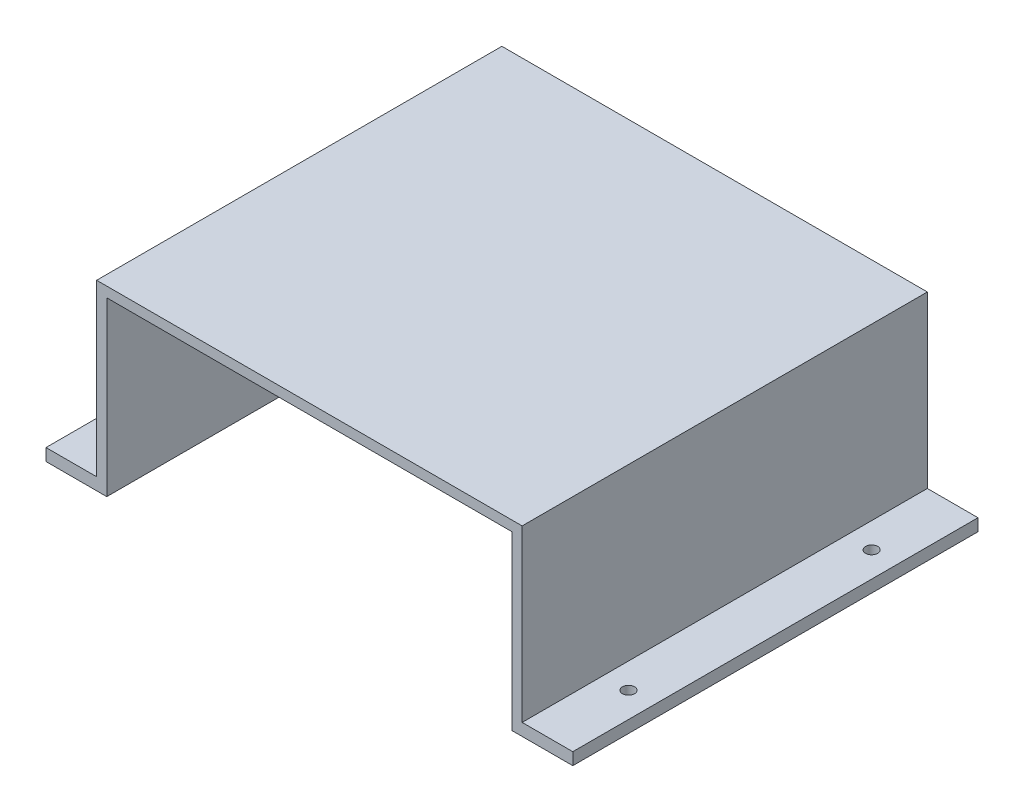
ISO-10303-21;
HEADER;
FILE_DESCRIPTION(('STEP AP214'),'2;1');
FILE_NAME('part.step','',(''),(''),'','','');
FILE_SCHEMA(('AUTOMOTIVE_DESIGN { 1 0 10303 214 1 1 1 1 }'));
ENDSEC;
DATA;
#1=APPLICATION_CONTEXT('core data for automotive mechanical design processes');
#2=APPLICATION_PROTOCOL_DEFINITION('international standard','automotive_design',2000,#1);
#3=PRODUCT_CONTEXT('',#1,'mechanical');
#4=PRODUCT('Part','Part','',(#3));
#5=PRODUCT_RELATED_PRODUCT_CATEGORY('part','',(#4));
#6=PRODUCT_DEFINITION_FORMATION('','',#4);
#7=PRODUCT_DEFINITION_CONTEXT('part definition',#1,'design');
#8=PRODUCT_DEFINITION('design','',#6,#7);
#9=PRODUCT_DEFINITION_SHAPE('','',#8);
#10=(LENGTH_UNIT() NAMED_UNIT(*) SI_UNIT(.MILLI.,.METRE.));
#11=(NAMED_UNIT(*) PLANE_ANGLE_UNIT() SI_UNIT($,.RADIAN.));
#12=(NAMED_UNIT(*) SI_UNIT($,.STERADIAN.) SOLID_ANGLE_UNIT());
#13=UNCERTAINTY_MEASURE_WITH_UNIT(LENGTH_MEASURE(1.E-05),#10,'distance_accuracy_value','');
#14=(GEOMETRIC_REPRESENTATION_CONTEXT(3) GLOBAL_UNCERTAINTY_ASSIGNED_CONTEXT((#13)) GLOBAL_UNIT_ASSIGNED_CONTEXT((#10,
#11,#12)) REPRESENTATION_CONTEXT('',''));
#15=CARTESIAN_POINT('',(0.,0.,0.));
#16=DIRECTION('',(0.,0.,1.));
#17=DIRECTION('',(1.,0.,0.));
#18=AXIS2_PLACEMENT_3D('',#15,#16,#17);
#19=CARTESIAN_POINT('',(34.5735404683645,-1.54051730772277,100.));
#20=DIRECTION('',(-1.,0.,0.));
#21=DIRECTION('',(0.,-1.,0.));
#22=AXIS2_PLACEMENT_3D('',#19,#20,#21);
#23=PLANE('',#22);
#24=DIRECTION('',(0.,0.,1.));
#25=VECTOR('',#24,1.);
#26=CARTESIAN_POINT('',(34.5735404683645,-43.5405173077228,0.));
#27=LINE('',#26,#25);
#28=CARTESIAN_POINT('',(34.5735404683645,-43.5405173077228,0.));
#29=VERTEX_POINT('',#28);
#30=CARTESIAN_POINT('',(34.5735404683645,-43.5405173077228,100.));
#31=VERTEX_POINT('',#30);
#32=EDGE_CURVE('E58',#29,#31,#27,.T.);
#33=ORIENTED_EDGE('',*,*,#32,.F.);
#34=DIRECTION('',(0.,1.,0.));
#35=VECTOR('',#34,1.);
#36=CARTESIAN_POINT('',(34.5735404683645,-1.54051730772277,0.));
#37=LINE('',#36,#35);
#38=CARTESIAN_POINT('',(34.5735404683645,-1.54051730772277,0.));
#39=VERTEX_POINT('',#38);
#40=EDGE_CURVE('E309',#29,#39,#37,.T.);
#41=ORIENTED_EDGE('',*,*,#40,.T.);
#42=DIRECTION('',(0.,0.,-1.));
#43=VECTOR('',#42,1.);
#44=CARTESIAN_POINT('',(34.5735404683645,-1.54051730772277,100.));
#45=LINE('',#44,#43);
#46=CARTESIAN_POINT('',(34.5735404683645,-1.54051730772277,100.));
#47=VERTEX_POINT('',#46);
#48=EDGE_CURVE('E314',#47,#39,#45,.T.);
#49=ORIENTED_EDGE('',*,*,#48,.F.);
#50=DIRECTION('',(0.,1.,0.));
#51=VECTOR('',#50,1.);
#52=CARTESIAN_POINT('',(34.5735404683645,-1.54051730772277,100.));
#53=LINE('',#52,#51);
#54=EDGE_CURVE('E302',#31,#47,#53,.T.);
#55=ORIENTED_EDGE('',*,*,#54,.F.);
#56=EDGE_LOOP('',(#33,#41,#49,#55));
#57=FACE_BOUND('',#56,.T.);
#58=ADVANCED_FACE('F43',(#57),#23,.F.);
#59=CARTESIAN_POINT('',(-70.4264595316355,-1.54051730772277,100.));
#60=DIRECTION('',(1.,0.,0.));
#61=DIRECTION('',(0.,1.,0.));
#62=AXIS2_PLACEMENT_3D('',#59,#60,#61);
#63=PLANE('',#62);
#64=DIRECTION('',(0.,0.,-1.));
#65=VECTOR('',#64,1.);
#66=CARTESIAN_POINT('',(-70.4264595316355,-43.5405173077228,0.));
#67=LINE('',#66,#65);
#68=CARTESIAN_POINT('',(-70.4264595316355,-43.5405173077228,100.));
#69=VERTEX_POINT('',#68);
#70=CARTESIAN_POINT('',(-70.4264595316355,-43.5405173077228,0.));
#71=VERTEX_POINT('',#70);
#72=EDGE_CURVE('E66',#69,#71,#67,.T.);
#73=ORIENTED_EDGE('',*,*,#72,.F.);
#74=DIRECTION('',(0.,-1.,0.));
#75=VECTOR('',#74,1.);
#76=CARTESIAN_POINT('',(-70.4264595316355,-1.54051730772277,100.));
#77=LINE('',#76,#75);
#78=CARTESIAN_POINT('',(-70.4264595316355,-1.54051730772277,100.));
#79=VERTEX_POINT('',#78);
#80=EDGE_CURVE('E300',#79,#69,#77,.T.);
#81=ORIENTED_EDGE('',*,*,#80,.F.);
#82=DIRECTION('',(0.,0.,-1.));
#83=VECTOR('',#82,1.);
#84=CARTESIAN_POINT('',(-70.4264595316355,-1.54051730772277,100.));
#85=LINE('',#84,#83);
#86=CARTESIAN_POINT('',(-70.4264595316355,-1.54051730772277,0.));
#87=VERTEX_POINT('',#86);
#88=EDGE_CURVE('E307',#79,#87,#85,.T.);
#89=ORIENTED_EDGE('',*,*,#88,.T.);
#90=DIRECTION('',(0.,-1.,0.));
#91=VECTOR('',#90,1.);
#92=CARTESIAN_POINT('',(-70.4264595316355,-1.54051730772277,0.));
#93=LINE('',#92,#91);
#94=EDGE_CURVE('E299',#87,#71,#93,.T.);
#95=ORIENTED_EDGE('',*,*,#94,.T.);
#96=EDGE_LOOP('',(#73,#81,#89,#95));
#97=FACE_BOUND('',#96,.T.);
#98=ADVANCED_FACE('F45',(#97),#63,.F.);
#99=CARTESIAN_POINT('',(0.,0.,3.));
#100=DIRECTION('',(0.,0.,-1.));
#101=DIRECTION('',(-1.,0.,0.));
#102=AXIS2_PLACEMENT_3D('',#99,#100,#101);
#103=PLANE('',#102);
#104=DIRECTION('',(0.,1.,0.));
#105=VECTOR('',#104,1.);
#106=CARTESIAN_POINT('',(-4.66867065580475,-74.5405173077228,3.));
#107=LINE('',#106,#105);
#108=CARTESIAN_POINT('',(-4.66867065580475,-46.5405173077228,3.));
#109=VERTEX_POINT('',#108);
#110=CARTESIAN_POINT('',(-4.66867065580475,-42.6279467462462,3.));
#111=VERTEX_POINT('',#110);
#112=EDGE_CURVE('E272',#109,#111,#107,.T.);
#113=ORIENTED_EDGE('',*,*,#112,.T.);
#114=DIRECTION('',(1.,0.,0.));
#115=VECTOR('',#114,1.);
#116=CARTESIAN_POINT('',(-31.1842484074662,-42.6279467462462,3.));
#117=LINE('',#116,#115);
#118=CARTESIAN_POINT('',(-31.1842484074662,-42.6279467462462,3.));
#119=VERTEX_POINT('',#118);
#120=EDGE_CURVE('E233',#119,#111,#117,.T.);
#121=ORIENTED_EDGE('',*,*,#120,.F.);
#122=DIRECTION('',(0.,1.,0.));
#123=VECTOR('',#122,1.);
#124=CARTESIAN_POINT('',(-31.1842484074662,-74.5405173077228,3.));
#125=LINE('',#124,#123);
#126=CARTESIAN_POINT('',(-31.1842484074662,-46.5405173077228,3.));
#127=VERTEX_POINT('',#126);
#128=EDGE_CURVE('E317',#127,#119,#125,.T.);
#129=ORIENTED_EDGE('',*,*,#128,.F.);
#130=DIRECTION('',(-1.,0.,0.));
#131=VECTOR('',#130,1.);
#132=CARTESIAN_POINT('',(0.,-46.5405173077228,3.));
#133=LINE('',#132,#131);
#134=EDGE_CURVE('E266',#109,#127,#133,.T.);
#135=ORIENTED_EDGE('',*,*,#134,.F.);
#136=EDGE_LOOP('',(#113,#121,#129,#135));
#137=FACE_BOUND('',#136,.T.);
#138=ADVANCED_FACE('F346',(#137),#103,.F.);
#139=CARTESIAN_POINT('',(32.0735404683645,-4.04051730772277,100.));
#140=DIRECTION('',(-1.,0.,0.));
#141=DIRECTION('',(0.,-1.,0.));
#142=AXIS2_PLACEMENT_3D('',#139,#140,#141);
#143=PLANE('',#142);
#144=DIRECTION('',(0.,1.,0.));
#145=VECTOR('',#144,1.);
#146=CARTESIAN_POINT('',(32.0735404683646,-74.5405173077228,46.2067055743989));
#147=LINE('',#146,#145);
#148=CARTESIAN_POINT('',(32.0735404683646,-4.04051730772277,46.2067055743989));
#149=VERTEX_POINT('',#148);
#150=CARTESIAN_POINT('',(32.0735404683646,-46.5405173077228,46.2067055743989));
#151=VERTEX_POINT('',#150);
#152=EDGE_CURVE('E275',#149,#151,#147,.F.);
#153=ORIENTED_EDGE('',*,*,#152,.T.);
#154=DIRECTION('',(0.,0.,1.));
#155=VECTOR('',#154,1.);
#156=CARTESIAN_POINT('',(32.0735404683645,-46.5405173077228,100.));
#157=LINE('',#156,#155);
#158=CARTESIAN_POINT('',(32.0735404683645,-46.5405173077228,100.));
#159=VERTEX_POINT('',#158);
#160=EDGE_CURVE('E269',#151,#159,#157,.T.);
#161=ORIENTED_EDGE('',*,*,#160,.T.);
#162=DIRECTION('',(0.,1.,0.));
#163=VECTOR('',#162,1.);
#164=CARTESIAN_POINT('',(32.0735404683645,-4.04051730772277,100.));
#165=LINE('',#164,#163);
#166=CARTESIAN_POINT('',(32.0735404683645,-4.04051730772277,100.));
#167=VERTEX_POINT('',#166);
#168=EDGE_CURVE('E289',#159,#167,#165,.T.);
#169=ORIENTED_EDGE('',*,*,#168,.T.);
#170=DIRECTION('',(0.,0.,-1.));
#171=VECTOR('',#170,1.);
#172=CARTESIAN_POINT('',(32.0735404683645,-4.04051730772277,100.));
#173=LINE('',#172,#171);
#174=EDGE_CURVE('E296',#167,#149,#173,.T.);
#175=ORIENTED_EDGE('',*,*,#174,.T.);
#176=EDGE_LOOP('',(#153,#161,#169,#175));
#177=FACE_BOUND('',#176,.T.);
#178=ADVANCED_FACE('F355',(#177),#143,.T.);
#179=CARTESIAN_POINT('',(-67.9264595316355,-4.04051730772277,100.));
#180=DIRECTION('',(1.,0.,0.));
#181=DIRECTION('',(0.,0.,-1.));
#182=AXIS2_PLACEMENT_3D('',#179,#180,#181);
#183=PLANE('',#182);
#184=DIRECTION('',(0.,-1.,0.));
#185=VECTOR('',#184,1.);
#186=CARTESIAN_POINT('',(-67.9264595316355,-4.04051730772277,100.));
#187=LINE('',#186,#185);
#188=CARTESIAN_POINT('',(-67.9264595316355,-4.04051730772277,100.));
#189=VERTEX_POINT('',#188);
#190=CARTESIAN_POINT('',(-67.9264595316355,-46.5405173077228,100.));
#191=VERTEX_POINT('',#190);
#192=EDGE_CURVE('E286',#189,#191,#187,.T.);
#193=ORIENTED_EDGE('',*,*,#192,.T.);
#194=DIRECTION('',(0.,0.,1.));
#195=VECTOR('',#194,1.);
#196=CARTESIAN_POINT('',(-67.9264595316355,-46.5405173077228,46.2067055743988));
#197=LINE('',#196,#195);
#198=CARTESIAN_POINT('',(-67.9264595316355,-46.5405173077228,46.2067055743988));
#199=VERTEX_POINT('',#198);
#200=EDGE_CURVE('E259',#199,#191,#197,.T.);
#201=ORIENTED_EDGE('',*,*,#200,.F.);
#202=DIRECTION('',(0.,1.,0.));
#203=VECTOR('',#202,1.);
#204=CARTESIAN_POINT('',(-67.9264595316355,-74.5405173077228,46.2067055743987));
#205=LINE('',#204,#203);
#206=CARTESIAN_POINT('',(-67.9264595316355,-4.04051730772277,46.2067055743987));
#207=VERTEX_POINT('',#206);
#208=EDGE_CURVE('E281',#199,#207,#205,.T.);
#209=ORIENTED_EDGE('',*,*,#208,.T.);
#210=DIRECTION('',(0.,0.,-1.));
#211=VECTOR('',#210,1.);
#212=CARTESIAN_POINT('',(-67.9264595316355,-4.04051730772277,100.));
#213=LINE('',#212,#211);
#214=EDGE_CURVE('E293',#189,#207,#213,.T.);
#215=ORIENTED_EDGE('',*,*,#214,.F.);
#216=EDGE_LOOP('',(#193,#201,#209,#215));
#217=FACE_BOUND('',#216,.T.);
#218=ADVANCED_FACE('F361',(#217),#183,.T.);
#219=CARTESIAN_POINT('',(0.,0.,100.));
#220=DIRECTION('',(0.,0.,1.));
#221=DIRECTION('',(1.,0.,0.));
#222=AXIS2_PLACEMENT_3D('',#219,#220,#221);
#223=PLANE('',#222);
#224=ORIENTED_EDGE('',*,*,#80,.T.);
#225=DIRECTION('',(1.,0.,0.));
#226=VECTOR('',#225,1.);
#227=CARTESIAN_POINT('',(0.,-43.5405173077228,100.000000000003));
#228=LINE('',#227,#226);
#229=CARTESIAN_POINT('',(-82.9264595316344,-43.5405173077228,100.000000000003));
#230=VERTEX_POINT('',#229);
#231=EDGE_CURVE('E219',#230,#69,#228,.T.);
#232=ORIENTED_EDGE('',*,*,#231,.F.);
#233=DIRECTION('',(0.,-1.,0.));
#234=VECTOR('',#233,1.);
#235=CARTESIAN_POINT('',(-82.9264595316344,-43.5405173077228,100.000000000003));
#236=LINE('',#235,#234);
#237=CARTESIAN_POINT('',(-82.9264595316344,-46.5405173077228,100.000000000003));
#238=VERTEX_POINT('',#237);
#239=EDGE_CURVE('E230',#230,#238,#236,.T.);
#240=ORIENTED_EDGE('',*,*,#239,.T.);
#241=DIRECTION('',(-1.,0.,0.));
#242=VECTOR('',#241,1.);
#243=CARTESIAN_POINT('',(-67.9264595316355,-46.5405173077228,100.));
#244=LINE('',#243,#242);
#245=EDGE_CURVE('E261',#191,#238,#244,.T.);
#246=ORIENTED_EDGE('',*,*,#245,.F.);
#247=ORIENTED_EDGE('',*,*,#192,.F.);
#248=DIRECTION('',(-1.,0.,0.));
#249=VECTOR('',#248,1.);
#250=CARTESIAN_POINT('',(-67.9264595316355,-4.04051730772277,100.));
#251=LINE('',#250,#249);
#252=EDGE_CURVE('E291',#167,#189,#251,.T.);
#253=ORIENTED_EDGE('',*,*,#252,.F.);
#254=ORIENTED_EDGE('',*,*,#168,.F.);
#255=DIRECTION('',(-1.,0.,0.));
#256=VECTOR('',#255,1.);
#257=CARTESIAN_POINT('',(34.5735404683646,-46.5405173077228,100.));
#258=LINE('',#257,#256);
#259=CARTESIAN_POINT('',(47.0735404683656,-46.5405173077228,100.000000000003));
#260=VERTEX_POINT('',#259);
#261=EDGE_CURVE('E175',#260,#159,#258,.T.);
#262=ORIENTED_EDGE('',*,*,#261,.F.);
#263=DIRECTION('',(0.,-1.,0.));
#264=VECTOR('',#263,1.);
#265=CARTESIAN_POINT('',(47.0735404683656,-43.5405173077228,100.000000000003));
#266=LINE('',#265,#264);
#267=CARTESIAN_POINT('',(47.0735404683656,-43.5405173077228,100.000000000003));
#268=VERTEX_POINT('',#267);
#269=EDGE_CURVE('E172',#268,#260,#266,.T.);
#270=ORIENTED_EDGE('',*,*,#269,.F.);
#271=DIRECTION('',(1.,0.,0.));
#272=VECTOR('',#271,1.);
#273=CARTESIAN_POINT('',(0.,-43.5405173077228,100.000000000003));
#274=LINE('',#273,#272);
#275=EDGE_CURVE('E162',#31,#268,#274,.T.);
#276=ORIENTED_EDGE('',*,*,#275,.F.);
#277=ORIENTED_EDGE('',*,*,#54,.T.);
#278=DIRECTION('',(-1.,0.,0.));
#279=VECTOR('',#278,1.);
#280=CARTESIAN_POINT('',(-70.4264595316355,-1.54051730772277,100.));
#281=LINE('',#280,#279);
#282=EDGE_CURVE('E305',#47,#79,#281,.T.);
#283=ORIENTED_EDGE('',*,*,#282,.T.);
#284=EDGE_LOOP('',(#224,#232,#240,#246,#247,#253,#254,#262,#270,#276,#277,#283));
#285=FACE_BOUND('',#284,.T.);
#286=ADVANCED_FACE('F173',(#285),#223,.T.);
#287=CARTESIAN_POINT('',(0.,0.,0.));
#288=DIRECTION('',(0.,0.,1.));
#289=DIRECTION('',(1.,0.,0.));
#290=AXIS2_PLACEMENT_3D('',#287,#288,#289);
#291=PLANE('',#290);
#292=CARTESIAN_POINT('',(24.5735404683645,-22.5405173077239,0.));
#293=DIRECTION('',(0.,0.,-1.));
#294=DIRECTION('',(-1.,0.,0.));
#295=AXIS2_PLACEMENT_3D('',#292,#293,#294);
#296=CIRCLE('',#295,1.5);
#297=CARTESIAN_POINT('',(23.0735404683645,-22.5405173077239,0.));
#298=VERTEX_POINT('',#297);
#299=EDGE_CURVE('E694',#298,#298,#296,.T.);
#300=ORIENTED_EDGE('',*,*,#299,.F.);
#301=EDGE_LOOP('',(#300));
#302=FACE_BOUND('',#301,.T.);
#303=CARTESIAN_POINT('',(-60.4264595316355,-22.5405173077239,0.));
#304=DIRECTION('',(0.,0.,-1.));
#305=DIRECTION('',(-1.,0.,0.));
#306=AXIS2_PLACEMENT_3D('',#303,#304,#305);
#307=CIRCLE('',#306,1.5);
#308=CARTESIAN_POINT('',(-61.9264595316355,-22.5405173077239,0.));
#309=VERTEX_POINT('',#308);
#310=EDGE_CURVE('E697',#309,#309,#307,.T.);
#311=ORIENTED_EDGE('',*,*,#310,.F.);
#312=EDGE_LOOP('',(#311));
#313=FACE_BOUND('',#312,.T.);
#314=DIRECTION('',(0.,1.,0.));
#315=VECTOR('',#314,1.);
#316=CARTESIAN_POINT('',(-31.1842484074662,0.,0.));
#317=LINE('',#316,#315);
#318=CARTESIAN_POINT('',(-31.1842484074662,-42.6279467462462,0.));
#319=VERTEX_POINT('',#318);
#320=CARTESIAN_POINT('',(-31.1842484074662,-4.04051730772277,0.));
#321=VERTEX_POINT('',#320);
#322=EDGE_CURVE('E255',#319,#321,#317,.T.);
#323=ORIENTED_EDGE('',*,*,#322,.F.);
#324=DIRECTION('',(1.,0.,0.));
#325=VECTOR('',#324,1.);
#326=CARTESIAN_POINT('',(0.,-42.6279467462462,0.));
#327=LINE('',#326,#325);
#328=CARTESIAN_POINT('',(-4.66867065580475,-42.6279467462462,0.));
#329=VERTEX_POINT('',#328);
#330=EDGE_CURVE('E11',#319,#329,#327,.T.);
#331=ORIENTED_EDGE('',*,*,#330,.T.);
#332=DIRECTION('',(0.,1.,0.));
#333=VECTOR('',#332,1.);
#334=CARTESIAN_POINT('',(-4.66867065580475,0.,0.));
#335=LINE('',#334,#333);
#336=CARTESIAN_POINT('',(-4.66867065580475,-4.04051730772277,0.));
#337=VERTEX_POINT('',#336);
#338=EDGE_CURVE('E246',#329,#337,#335,.T.);
#339=ORIENTED_EDGE('',*,*,#338,.T.);
#340=DIRECTION('',(1.,0.,0.));
#341=VECTOR('',#340,1.);
#342=CARTESIAN_POINT('',(0.,-4.04051730772277,0.));
#343=LINE('',#342,#341);
#344=EDGE_CURVE('E51',#321,#337,#343,.T.);
#345=ORIENTED_EDGE('',*,*,#344,.F.);
#346=EDGE_LOOP('',(#323,#331,#339,#345));
#347=FACE_BOUND('',#346,.T.);
#348=DIRECTION('',(1.,0.,0.));
#349=VECTOR('',#348,1.);
#350=CARTESIAN_POINT('',(-70.4264595316355,-46.5405173077228,0.));
#351=LINE('',#350,#349);
#352=CARTESIAN_POINT('',(-82.9264595316344,-46.5405173077228,3.28903571045203E-12));
#353=VERTEX_POINT('',#352);
#354=CARTESIAN_POINT('',(47.0735404683656,-46.5405173077228,3.28903571045203E-12));
#355=VERTEX_POINT('',#354);
#356=EDGE_CURVE('E263',#353,#355,#351,.T.);
#357=ORIENTED_EDGE('',*,*,#356,.F.);
#358=DIRECTION('',(0.,-1.,0.));
#359=VECTOR('',#358,1.);
#360=CARTESIAN_POINT('',(-82.9264595316344,-43.5405173077228,3.28903571045203E-12));
#361=LINE('',#360,#359);
#362=CARTESIAN_POINT('',(-82.9264595316344,-43.5405173077228,3.28903571045203E-12));
#363=VERTEX_POINT('',#362);
#364=EDGE_CURVE('E222',#363,#353,#361,.T.);
#365=ORIENTED_EDGE('',*,*,#364,.F.);
#366=DIRECTION('',(1.,0.,0.));
#367=VECTOR('',#366,1.);
#368=CARTESIAN_POINT('',(0.,-43.5405173077228,3.28903571045203E-12));
#369=LINE('',#368,#367);
#370=EDGE_CURVE('E215',#363,#71,#369,.T.);
#371=ORIENTED_EDGE('',*,*,#370,.T.);
#372=ORIENTED_EDGE('',*,*,#94,.F.);
#373=DIRECTION('',(-1.,0.,0.));
#374=VECTOR('',#373,1.);
#375=CARTESIAN_POINT('',(-70.4264595316355,-1.54051730772277,0.));
#376=LINE('',#375,#374);
#377=EDGE_CURVE('E303',#39,#87,#376,.T.);
#378=ORIENTED_EDGE('',*,*,#377,.F.);
#379=ORIENTED_EDGE('',*,*,#40,.F.);
#380=DIRECTION('',(1.,0.,0.));
#381=VECTOR('',#380,1.);
#382=CARTESIAN_POINT('',(0.,-43.5405173077228,3.28903571045203E-12));
#383=LINE('',#382,#381);
#384=CARTESIAN_POINT('',(47.0735404683656,-43.5405173077228,3.28903571045203E-12));
#385=VERTEX_POINT('',#384);
#386=EDGE_CURVE('E180',#29,#385,#383,.T.);
#387=ORIENTED_EDGE('',*,*,#386,.T.);
#388=DIRECTION('',(0.,-1.,0.));
#389=VECTOR('',#388,1.);
#390=CARTESIAN_POINT('',(47.0735404683656,-43.5405173077228,3.28903571045203E-12));
#391=LINE('',#390,#389);
#392=EDGE_CURVE('E179',#385,#355,#391,.T.);
#393=ORIENTED_EDGE('',*,*,#392,.T.);
#394=EDGE_LOOP('',(#357,#365,#371,#372,#378,#379,#387,#393));
#395=FACE_BOUND('',#394,.T.);
#396=ADVANCED_FACE('F329',(#302,#313,#347,#395),#291,.F.);
#397=CARTESIAN_POINT('',(-17.9264595316355,-74.5405173077228,51.5));
#398=DIRECTION('',(0.,1.,0.));
#399=DIRECTION('',(0.,0.,1.));
#400=AXIS2_PLACEMENT_3D('',#397,#398,#399);
#401=CYLINDRICAL_SURFACE('',#400,50.2794089650634);
#402=CARTESIAN_POINT('',(-17.9264595316355,-46.5405173077228,51.5));
#403=DIRECTION('',(0.,1.,0.));
#404=DIRECTION('',(0.,0.,-1.));
#405=AXIS2_PLACEMENT_3D('',#402,#403,#404);
#406=CIRCLE('',#405,50.2794089650634);
#407=EDGE_CURVE('E257',#127,#199,#406,.T.);
#408=ORIENTED_EDGE('',*,*,#407,.F.);
#409=ORIENTED_EDGE('',*,*,#128,.T.);
#410=DIRECTION('',(0.,1.,0.));
#411=VECTOR('',#410,1.);
#412=CARTESIAN_POINT('',(-31.1842484074662,-42.6279467462462,3.));
#413=LINE('',#412,#411);
#414=CARTESIAN_POINT('',(-31.1842484074662,-4.04051730772277,3.));
#415=VERTEX_POINT('',#414);
#416=EDGE_CURVE('E240',#119,#415,#413,.T.);
#417=ORIENTED_EDGE('',*,*,#416,.T.);
#418=CARTESIAN_POINT('',(-17.9264595316355,-4.04051730772277,51.5));
#419=DIRECTION('',(0.,-1.,0.));
#420=DIRECTION('',(0.,0.,-1.));
#421=AXIS2_PLACEMENT_3D('',#418,#419,#420);
#422=CIRCLE('',#421,50.2794089650634);
#423=EDGE_CURVE('E283',#207,#415,#422,.T.);
#424=ORIENTED_EDGE('',*,*,#423,.F.);
#425=ORIENTED_EDGE('',*,*,#208,.F.);
#426=EDGE_LOOP('',(#408,#409,#417,#424,#425));
#427=FACE_BOUND('',#426,.T.);
#428=ADVANCED_FACE('F364',(#427),#401,.F.);
#429=CARTESIAN_POINT('',(-17.9264595316355,-74.5405173077228,51.5));
#430=DIRECTION('',(0.,1.,0.));
#431=DIRECTION('',(0.,0.,1.));
#432=AXIS2_PLACEMENT_3D('',#429,#430,#431);
#433=CYLINDRICAL_SURFACE('',#432,50.2794089650634);
#434=CARTESIAN_POINT('',(-17.9264595316355,-46.5405173077228,51.5));
#435=DIRECTION('',(0.,-1.,0.));
#436=DIRECTION('',(0.,0.,-1.));
#437=AXIS2_PLACEMENT_3D('',#434,#435,#436);
#438=CIRCLE('',#437,50.2794089650634);
#439=EDGE_CURVE('E320',#151,#109,#438,.F.);
#440=ORIENTED_EDGE('',*,*,#439,.F.);
#441=ORIENTED_EDGE('',*,*,#152,.F.);
#442=CARTESIAN_POINT('',(-17.9264595316355,-4.04051730772277,51.5));
#443=DIRECTION('',(0.,-1.,0.));
#444=DIRECTION('',(0.,0.,-1.));
#445=AXIS2_PLACEMENT_3D('',#442,#443,#444);
#446=CIRCLE('',#445,50.2794089650634);
#447=CARTESIAN_POINT('',(-4.66867065580475,-4.04051730772277,3.));
#448=VERTEX_POINT('',#447);
#449=EDGE_CURVE('E278',#448,#149,#446,.T.);
#450=ORIENTED_EDGE('',*,*,#449,.F.);
#451=DIRECTION('',(0.,1.,0.));
#452=VECTOR('',#451,1.);
#453=CARTESIAN_POINT('',(-4.66867065580475,-42.6279467462462,3.));
#454=LINE('',#453,#452);
#455=EDGE_CURVE('E238',#111,#448,#454,.T.);
#456=ORIENTED_EDGE('',*,*,#455,.F.);
#457=ORIENTED_EDGE('',*,*,#112,.F.);
#458=EDGE_LOOP('',(#440,#441,#450,#456,#457));
#459=FACE_BOUND('',#458,.T.);
#460=ADVANCED_FACE('F344',(#459),#433,.F.);
#461=CARTESIAN_POINT('',(-67.9264595316355,-4.04051730772277,100.));
#462=DIRECTION('',(0.,-1.,0.));
#463=DIRECTION('',(0.,0.,-1.));
#464=AXIS2_PLACEMENT_3D('',#461,#462,#463);
#465=PLANE('',#464);
#466=ORIENTED_EDGE('',*,*,#423,.T.);
#467=DIRECTION('',(0.,0.,1.));
#468=VECTOR('',#467,1.);
#469=CARTESIAN_POINT('',(-31.1842484074662,-4.04051730772277,-68.));
#470=LINE('',#469,#468);
#471=EDGE_CURVE('E247',#321,#415,#470,.T.);
#472=ORIENTED_EDGE('',*,*,#471,.F.);
#473=ORIENTED_EDGE('',*,*,#344,.T.);
#474=DIRECTION('',(0.,0.,1.));
#475=VECTOR('',#474,1.);
#476=CARTESIAN_POINT('',(-4.66867065580475,-4.04051730772277,-68.));
#477=LINE('',#476,#475);
#478=EDGE_CURVE('E249',#337,#448,#477,.T.);
#479=ORIENTED_EDGE('',*,*,#478,.T.);
#480=ORIENTED_EDGE('',*,*,#449,.T.);
#481=ORIENTED_EDGE('',*,*,#174,.F.);
#482=ORIENTED_EDGE('',*,*,#252,.T.);
#483=ORIENTED_EDGE('',*,*,#214,.T.);
#484=EDGE_LOOP('',(#466,#472,#473,#479,#480,#481,#482,#483));
#485=FACE_BOUND('',#484,.T.);
#486=ADVANCED_FACE('F325',(#485),#465,.T.);
#487=CARTESIAN_POINT('',(-70.4264595316355,-1.54051730772277,100.));
#488=DIRECTION('',(0.,-1.,0.));
#489=DIRECTION('',(0.,0.,-1.));
#490=AXIS2_PLACEMENT_3D('',#487,#488,#489);
#491=PLANE('',#490);
#492=ORIENTED_EDGE('',*,*,#377,.T.);
#493=ORIENTED_EDGE('',*,*,#88,.F.);
#494=ORIENTED_EDGE('',*,*,#282,.F.);
#495=ORIENTED_EDGE('',*,*,#48,.T.);
#496=EDGE_LOOP('',(#492,#493,#494,#495));
#497=FACE_BOUND('',#496,.T.);
#498=ADVANCED_FACE('F383',(#497),#491,.F.);
#499=CARTESIAN_POINT('',(-17.9264595316355,-46.5405173077228,51.5));
#500=DIRECTION('',(0.,-1.,0.));
#501=DIRECTION('',(0.,0.,-1.));
#502=AXIS2_PLACEMENT_3D('',#499,#500,#501);
#503=PLANE('',#502);
#504=ORIENTED_EDGE('',*,*,#160,.F.);
#505=ORIENTED_EDGE('',*,*,#439,.T.);
#506=ORIENTED_EDGE('',*,*,#134,.T.);
#507=ORIENTED_EDGE('',*,*,#407,.T.);
#508=ORIENTED_EDGE('',*,*,#200,.T.);
#509=ORIENTED_EDGE('',*,*,#245,.T.);
#510=DIRECTION('',(0.,0.,-1.));
#511=VECTOR('',#510,1.);
#512=CARTESIAN_POINT('',(-82.9264595316344,-46.5405173077228,0.));
#513=LINE('',#512,#511);
#514=EDGE_CURVE('E209',#238,#353,#513,.T.);
#515=ORIENTED_EDGE('',*,*,#514,.T.);
#516=ORIENTED_EDGE('',*,*,#356,.T.);
#517=DIRECTION('',(0.,0.,-1.));
#518=VECTOR('',#517,1.);
#519=CARTESIAN_POINT('',(47.0735404683656,-46.5405173077228,0.));
#520=LINE('',#519,#518);
#521=EDGE_CURVE('E201',#260,#355,#520,.T.);
#522=ORIENTED_EDGE('',*,*,#521,.F.);
#523=ORIENTED_EDGE('',*,*,#261,.T.);
#524=EDGE_LOOP('',(#504,#505,#506,#507,#508,#509,#515,#516,#522,#523));
#525=FACE_BOUND('',#524,.T.);
#526=CARTESIAN_POINT('',(-76.6764595316355,-46.5405173077228,20.0000000000033));
#527=DIRECTION('',(0.,-1.,0.));
#528=DIRECTION('',(0.,0.,-1.));
#529=AXIS2_PLACEMENT_3D('',#526,#527,#528);
#530=CIRCLE('',#529,1.5);
#531=CARTESIAN_POINT('',(-76.6764595316355,-46.5405173077228,18.5000000000033));
#532=VERTEX_POINT('',#531);
#533=EDGE_CURVE('E203',#532,#532,#530,.T.);
#534=ORIENTED_EDGE('',*,*,#533,.F.);
#535=EDGE_LOOP('',(#534));
#536=FACE_BOUND('',#535,.T.);
#537=CARTESIAN_POINT('',(-76.6764595316355,-46.5405173077228,80.0000000000033));
#538=DIRECTION('',(0.,-1.,0.));
#539=DIRECTION('',(0.,0.,-1.));
#540=AXIS2_PLACEMENT_3D('',#537,#538,#539);
#541=CIRCLE('',#540,1.5);
#542=CARTESIAN_POINT('',(-76.6764595316355,-46.5405173077228,78.5000000000033));
#543=VERTEX_POINT('',#542);
#544=EDGE_CURVE('E225',#543,#543,#541,.T.);
#545=ORIENTED_EDGE('',*,*,#544,.F.);
#546=EDGE_LOOP('',(#545));
#547=FACE_BOUND('',#546,.T.);
#548=CARTESIAN_POINT('',(40.8235404683656,-46.5405173077228,20.000000000002));
#549=DIRECTION('',(0.,-1.,0.));
#550=DIRECTION('',(0.,0.,-1.));
#551=AXIS2_PLACEMENT_3D('',#548,#549,#550);
#552=CIRCLE('',#551,1.5);
#553=CARTESIAN_POINT('',(40.8235404683656,-46.5405173077228,18.500000000002));
#554=VERTEX_POINT('',#553);
#555=EDGE_CURVE('E194',#554,#554,#552,.T.);
#556=ORIENTED_EDGE('',*,*,#555,.F.);
#557=EDGE_LOOP('',(#556));
#558=FACE_BOUND('',#557,.T.);
#559=CARTESIAN_POINT('',(40.8235404683656,-46.5405173077228,80.0000000000033));
#560=DIRECTION('',(0.,-1.,0.));
#561=DIRECTION('',(0.,0.,-1.));
#562=AXIS2_PLACEMENT_3D('',#559,#560,#561);
#563=CIRCLE('',#562,1.5);
#564=CARTESIAN_POINT('',(40.8235404683656,-46.5405173077228,78.5000000000033));
#565=VERTEX_POINT('',#564);
#566=EDGE_CURVE('E197',#565,#565,#563,.T.);
#567=ORIENTED_EDGE('',*,*,#566,.F.);
#568=EDGE_LOOP('',(#567));
#569=FACE_BOUND('',#568,.T.);
#570=ADVANCED_FACE('F349',(#525,#536,#547,#558,#569),#503,.T.);
#571=CARTESIAN_POINT('',(-31.1842484074662,-42.6279467462462,-68.));
#572=DIRECTION('',(0.,-1.,0.));
#573=DIRECTION('',(0.,0.,-1.));
#574=AXIS2_PLACEMENT_3D('',#571,#572,#573);
#575=PLANE('',#574);
#576=DIRECTION('',(0.,0.,1.));
#577=VECTOR('',#576,1.);
#578=CARTESIAN_POINT('',(-31.1842484074662,-42.6279467462462,-68.));
#579=LINE('',#578,#577);
#580=EDGE_CURVE('E244',#319,#119,#579,.T.);
#581=ORIENTED_EDGE('',*,*,#580,.T.);
#582=ORIENTED_EDGE('',*,*,#120,.T.);
#583=DIRECTION('',(0.,0.,1.));
#584=VECTOR('',#583,1.);
#585=CARTESIAN_POINT('',(-4.66867065580475,-42.6279467462462,-68.));
#586=LINE('',#585,#584);
#587=EDGE_CURVE('E243',#329,#111,#586,.T.);
#588=ORIENTED_EDGE('',*,*,#587,.F.);
#589=ORIENTED_EDGE('',*,*,#330,.F.);
#590=EDGE_LOOP('',(#581,#582,#588,#589));
#591=FACE_BOUND('',#590,.T.);
#592=ADVANCED_FACE('F335',(#591),#575,.F.);
#593=CARTESIAN_POINT('',(-31.1842484074662,-42.6279467462462,-68.));
#594=DIRECTION('',(1.,0.,0.));
#595=DIRECTION('',(0.,0.,-1.));
#596=AXIS2_PLACEMENT_3D('',#593,#594,#595);
#597=PLANE('',#596);
#598=ORIENTED_EDGE('',*,*,#322,.T.);
#599=ORIENTED_EDGE('',*,*,#471,.T.);
#600=ORIENTED_EDGE('',*,*,#416,.F.);
#601=ORIENTED_EDGE('',*,*,#580,.F.);
#602=EDGE_LOOP('',(#598,#599,#600,#601));
#603=FACE_BOUND('',#602,.T.);
#604=ADVANCED_FACE('F366',(#603),#597,.T.);
#605=CARTESIAN_POINT('',(-4.66867065580475,-42.6279467462462,-68.));
#606=DIRECTION('',(1.,0.,0.));
#607=DIRECTION('',(0.,0.,-1.));
#608=AXIS2_PLACEMENT_3D('',#605,#606,#607);
#609=PLANE('',#608);
#610=ORIENTED_EDGE('',*,*,#587,.T.);
#611=ORIENTED_EDGE('',*,*,#455,.T.);
#612=ORIENTED_EDGE('',*,*,#478,.F.);
#613=ORIENTED_EDGE('',*,*,#338,.F.);
#614=EDGE_LOOP('',(#610,#611,#612,#613));
#615=FACE_BOUND('',#614,.T.);
#616=ADVANCED_FACE('F333',(#615),#609,.F.);
#617=CARTESIAN_POINT('',(-82.9264595316344,-43.5405173077228,0.));
#618=DIRECTION('',(-1.,0.,0.));
#619=DIRECTION('',(0.,0.,1.));
#620=AXIS2_PLACEMENT_3D('',#617,#618,#619);
#621=PLANE('',#620);
#622=ORIENTED_EDGE('',*,*,#514,.F.);
#623=ORIENTED_EDGE('',*,*,#239,.F.);
#624=DIRECTION('',(0.,0.,-1.));
#625=VECTOR('',#624,1.);
#626=CARTESIAN_POINT('',(-82.9264595316344,-43.5405173077228,0.));
#627=LINE('',#626,#625);
#628=EDGE_CURVE('E212',#230,#363,#627,.T.);
#629=ORIENTED_EDGE('',*,*,#628,.T.);
#630=ORIENTED_EDGE('',*,*,#364,.T.);
#631=EDGE_LOOP('',(#622,#623,#629,#630));
#632=FACE_BOUND('',#631,.T.);
#633=ADVANCED_FACE('F373',(#632),#621,.T.);
#634=CARTESIAN_POINT('',(-76.6764595316355,-43.5405173077228,80.0000000000033));
#635=DIRECTION('',(0.,-1.,0.));
#636=DIRECTION('',(0.,0.,-1.));
#637=AXIS2_PLACEMENT_3D('',#634,#635,#636);
#638=CYLINDRICAL_SURFACE('',#637,1.5);
#639=CARTESIAN_POINT('',(-76.6764595316355,-43.5405173077228,80.0000000000033));
#640=DIRECTION('',(0.,-1.,0.));
#641=DIRECTION('',(0.,0.,-1.));
#642=AXIS2_PLACEMENT_3D('',#639,#640,#641);
#643=CIRCLE('',#642,1.5);
#644=CARTESIAN_POINT('',(-76.6764595316355,-43.5405173077228,78.5000000000033));
#645=VERTEX_POINT('',#644);
#646=EDGE_CURVE('E208',#645,#645,#643,.T.);
#647=ORIENTED_EDGE('',*,*,#646,.F.);
#648=EDGE_LOOP('',(#647));
#649=FACE_BOUND('',#648,.T.);
#650=ORIENTED_EDGE('',*,*,#544,.T.);
#651=EDGE_LOOP('',(#650));
#652=FACE_BOUND('',#651,.T.);
#653=ADVANCED_FACE('F438',(#649,#652),#638,.F.);
#654=CARTESIAN_POINT('',(-76.6764595316355,-43.5405173077228,20.0000000000033));
#655=DIRECTION('',(0.,-1.,0.));
#656=DIRECTION('',(0.,0.,-1.));
#657=AXIS2_PLACEMENT_3D('',#654,#655,#656);
#658=CYLINDRICAL_SURFACE('',#657,1.5);
#659=CARTESIAN_POINT('',(-76.6764595316355,-43.5405173077228,20.0000000000033));
#660=DIRECTION('',(0.,-1.,0.));
#661=DIRECTION('',(0.,0.,-1.));
#662=AXIS2_PLACEMENT_3D('',#659,#660,#661);
#663=CIRCLE('',#662,1.5);
#664=CARTESIAN_POINT('',(-76.6764595316355,-43.5405173077228,18.5000000000033));
#665=VERTEX_POINT('',#664);
#666=EDGE_CURVE('E205',#665,#665,#663,.T.);
#667=ORIENTED_EDGE('',*,*,#666,.F.);
#668=EDGE_LOOP('',(#667));
#669=FACE_BOUND('',#668,.T.);
#670=ORIENTED_EDGE('',*,*,#533,.T.);
#671=EDGE_LOOP('',(#670));
#672=FACE_BOUND('',#671,.T.);
#673=ADVANCED_FACE('F446',(#669,#672),#658,.F.);
#674=CARTESIAN_POINT('',(0.,-43.5405173077228,0.));
#675=DIRECTION('',(0.,-1.,0.));
#676=DIRECTION('',(0.,0.,-1.));
#677=AXIS2_PLACEMENT_3D('',#674,#675,#676);
#678=PLANE('',#677);
#679=ORIENTED_EDGE('',*,*,#666,.T.);
#680=EDGE_LOOP('',(#679));
#681=FACE_BOUND('',#680,.T.);
#682=ORIENTED_EDGE('',*,*,#646,.T.);
#683=EDGE_LOOP('',(#682));
#684=FACE_BOUND('',#683,.T.);
#685=ORIENTED_EDGE('',*,*,#628,.F.);
#686=ORIENTED_EDGE('',*,*,#231,.T.);
#687=ORIENTED_EDGE('',*,*,#72,.T.);
#688=ORIENTED_EDGE('',*,*,#370,.F.);
#689=EDGE_LOOP('',(#685,#686,#687,#688));
#690=FACE_BOUND('',#689,.T.);
#691=ADVANCED_FACE('F454',(#681,#684,#690),#678,.F.);
#692=CARTESIAN_POINT('',(47.0735404683656,-43.5405173077228,0.));
#693=DIRECTION('',(-1.,0.,0.));
#694=DIRECTION('',(0.,0.,1.));
#695=AXIS2_PLACEMENT_3D('',#692,#693,#694);
#696=PLANE('',#695);
#697=ORIENTED_EDGE('',*,*,#521,.T.);
#698=ORIENTED_EDGE('',*,*,#392,.F.);
#699=DIRECTION('',(0.,0.,-1.));
#700=VECTOR('',#699,1.);
#701=CARTESIAN_POINT('',(47.0735404683656,-43.5405173077228,0.));
#702=LINE('',#701,#700);
#703=EDGE_CURVE('E167',#268,#385,#702,.T.);
#704=ORIENTED_EDGE('',*,*,#703,.F.);
#705=ORIENTED_EDGE('',*,*,#269,.T.);
#706=EDGE_LOOP('',(#697,#698,#704,#705));
#707=FACE_BOUND('',#706,.T.);
#708=ADVANCED_FACE('F182',(#707),#696,.F.);
#709=CARTESIAN_POINT('',(40.8235404683656,-43.5405173077228,80.0000000000033));
#710=DIRECTION('',(0.,-1.,0.));
#711=DIRECTION('',(0.,0.,-1.));
#712=AXIS2_PLACEMENT_3D('',#709,#710,#711);
#713=CYLINDRICAL_SURFACE('',#712,1.5);
#714=CARTESIAN_POINT('',(40.8235404683656,-43.5405173077228,80.0000000000033));
#715=DIRECTION('',(0.,-1.,0.));
#716=DIRECTION('',(0.,0.,-1.));
#717=AXIS2_PLACEMENT_3D('',#714,#715,#716);
#718=CIRCLE('',#717,1.5);
#719=CARTESIAN_POINT('',(40.8235404683656,-43.5405173077228,78.5000000000033));
#720=VERTEX_POINT('',#719);
#721=EDGE_CURVE('E185',#720,#720,#718,.T.);
#722=ORIENTED_EDGE('',*,*,#721,.F.);
#723=EDGE_LOOP('',(#722));
#724=FACE_BOUND('',#723,.T.);
#725=ORIENTED_EDGE('',*,*,#566,.T.);
#726=EDGE_LOOP('',(#725));
#727=FACE_BOUND('',#726,.T.);
#728=ADVANCED_FACE('F468',(#724,#727),#713,.F.);
#729=CARTESIAN_POINT('',(40.8235404683656,-43.5405173077228,20.000000000002));
#730=DIRECTION('',(0.,-1.,0.));
#731=DIRECTION('',(0.,0.,-1.));
#732=AXIS2_PLACEMENT_3D('',#729,#730,#731);
#733=CYLINDRICAL_SURFACE('',#732,1.5);
#734=CARTESIAN_POINT('',(40.8235404683656,-43.5405173077228,20.000000000002));
#735=DIRECTION('',(0.,-1.,0.));
#736=DIRECTION('',(0.,0.,-1.));
#737=AXIS2_PLACEMENT_3D('',#734,#735,#736);
#738=CIRCLE('',#737,1.5);
#739=CARTESIAN_POINT('',(40.8235404683656,-43.5405173077228,18.500000000002));
#740=VERTEX_POINT('',#739);
#741=EDGE_CURVE('E188',#740,#740,#738,.T.);
#742=ORIENTED_EDGE('',*,*,#741,.F.);
#743=EDGE_LOOP('',(#742));
#744=FACE_BOUND('',#743,.T.);
#745=ORIENTED_EDGE('',*,*,#555,.T.);
#746=EDGE_LOOP('',(#745));
#747=FACE_BOUND('',#746,.T.);
#748=ADVANCED_FACE('F475',(#744,#747),#733,.F.);
#749=CARTESIAN_POINT('',(0.,-43.5405173077228,0.));
#750=DIRECTION('',(0.,-1.,0.));
#751=DIRECTION('',(0.,0.,-1.));
#752=AXIS2_PLACEMENT_3D('',#749,#750,#751);
#753=PLANE('',#752);
#754=ORIENTED_EDGE('',*,*,#741,.T.);
#755=EDGE_LOOP('',(#754));
#756=FACE_BOUND('',#755,.T.);
#757=ORIENTED_EDGE('',*,*,#721,.T.);
#758=EDGE_LOOP('',(#757));
#759=FACE_BOUND('',#758,.T.);
#760=ORIENTED_EDGE('',*,*,#703,.T.);
#761=ORIENTED_EDGE('',*,*,#386,.F.);
#762=ORIENTED_EDGE('',*,*,#32,.T.);
#763=ORIENTED_EDGE('',*,*,#275,.T.);
#764=EDGE_LOOP('',(#760,#761,#762,#763));
#765=FACE_BOUND('',#764,.T.);
#766=ADVANCED_FACE('F164',(#756,#759,#765),#753,.F.);
#767=CARTESIAN_POINT('',(-60.4264595316355,-22.5405173077239,6.));
#768=DIRECTION('',(0.,0.,-1.));
#769=DIRECTION('',(-1.,0.,0.));
#770=AXIS2_PLACEMENT_3D('',#767,#768,#769);
#771=CYLINDRICAL_SURFACE('',#770,1.5);
#772=CARTESIAN_POINT('',(-60.4264595316355,-22.5405173077239,6.));
#773=DIRECTION('',(0.,0.,-1.));
#774=DIRECTION('',(-1.,0.,0.));
#775=AXIS2_PLACEMENT_3D('',#772,#773,#774);
#776=CIRCLE('',#775,1.5);
#777=CARTESIAN_POINT('',(-61.9264595316355,-22.5405173077239,6.));
#778=VERTEX_POINT('',#777);
#779=EDGE_CURVE('E702',#778,#778,#776,.T.);
#780=ORIENTED_EDGE('',*,*,#779,.F.);
#781=EDGE_LOOP('',(#780));
#782=FACE_BOUND('',#781,.T.);
#783=ORIENTED_EDGE('',*,*,#310,.T.);
#784=EDGE_LOOP('',(#783));
#785=FACE_BOUND('',#784,.T.);
#786=ADVANCED_FACE('F490',(#782,#785),#771,.F.);
#787=CARTESIAN_POINT('',(-60.4264595316355,-22.5405173077239,6.));
#788=DIRECTION('',(0.,0.,-1.));
#789=DIRECTION('',(-1.,0.,0.));
#790=AXIS2_PLACEMENT_3D('',#787,#788,#789);
#791=PLANE('',#790);
#792=ORIENTED_EDGE('',*,*,#779,.T.);
#793=EDGE_LOOP('',(#792));
#794=FACE_BOUND('',#793,.T.);
#795=ADVANCED_FACE('F498',(#794),#791,.T.);
#796=CARTESIAN_POINT('',(24.5735404683645,-22.5405173077239,6.));
#797=DIRECTION('',(0.,0.,-1.));
#798=DIRECTION('',(-1.,0.,0.));
#799=AXIS2_PLACEMENT_3D('',#796,#797,#798);
#800=CYLINDRICAL_SURFACE('',#799,1.5);
#801=CARTESIAN_POINT('',(24.5735404683645,-22.5405173077239,6.));
#802=DIRECTION('',(0.,0.,-1.));
#803=DIRECTION('',(-1.,0.,0.));
#804=AXIS2_PLACEMENT_3D('',#801,#802,#803);
#805=CIRCLE('',#804,1.5);
#806=CARTESIAN_POINT('',(23.0735404683645,-22.5405173077239,6.));
#807=VERTEX_POINT('',#806);
#808=EDGE_CURVE('E198',#807,#807,#805,.T.);
#809=ORIENTED_EDGE('',*,*,#808,.F.);
#810=EDGE_LOOP('',(#809));
#811=FACE_BOUND('',#810,.T.);
#812=ORIENTED_EDGE('',*,*,#299,.T.);
#813=EDGE_LOOP('',(#812));
#814=FACE_BOUND('',#813,.T.);
#815=ADVANCED_FACE('F506',(#811,#814),#800,.F.);
#816=CARTESIAN_POINT('',(24.5735404683645,-22.5405173077239,6.));
#817=DIRECTION('',(0.,0.,-1.));
#818=DIRECTION('',(-1.,0.,0.));
#819=AXIS2_PLACEMENT_3D('',#816,#817,#818);
#820=PLANE('',#819);
#821=ORIENTED_EDGE('',*,*,#808,.T.);
#822=EDGE_LOOP('',(#821));
#823=FACE_BOUND('',#822,.T.);
#824=ADVANCED_FACE('F514',(#823),#820,.T.);
#825=CLOSED_SHELL('',(#58,#98,#138,#178,#218,#286,#396,#428,#460,#486,#498,#570,#592,#604,#616,
#633,#653,#673,#691,#708,#728,#748,#766,#786,#795,#815,#824));
#826=MANIFOLD_SOLID_BREP('B2',#825);
#827=ADVANCED_BREP_SHAPE_REPRESENTATION('',(#18,#826),#14);
#828=SHAPE_DEFINITION_REPRESENTATION(#9,#827);
ENDSEC;
END-ISO-10303-21;
